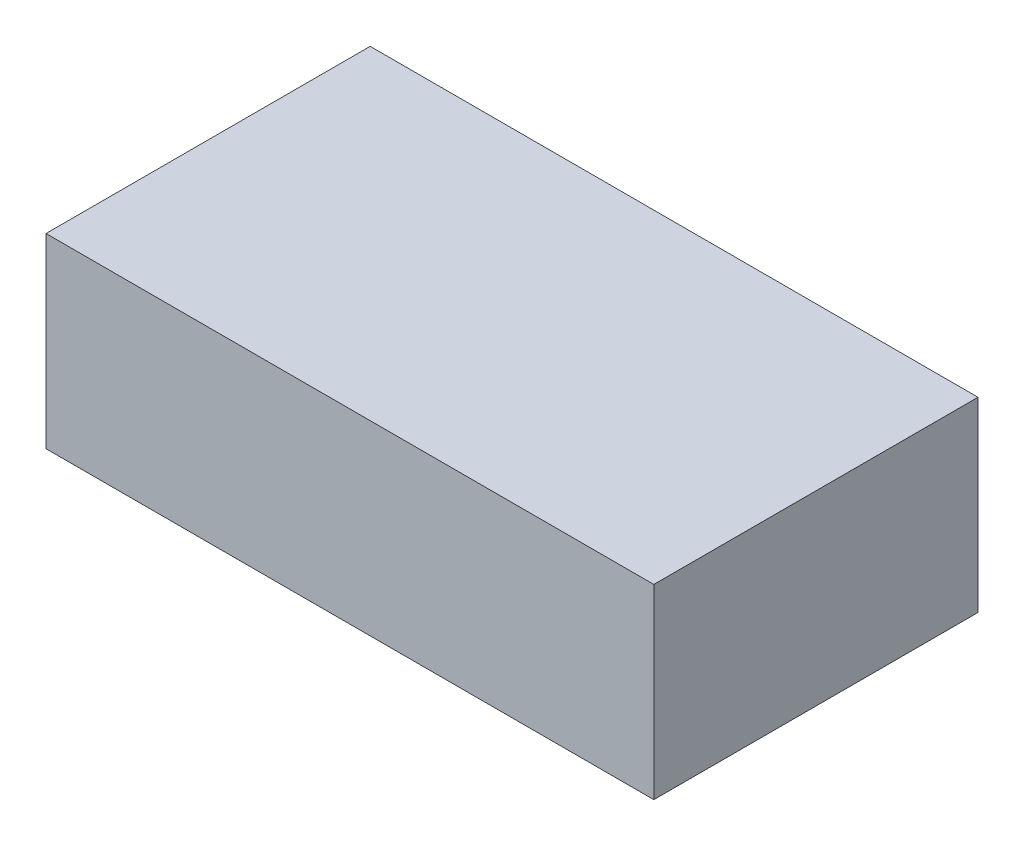
ISO-10303-21;
HEADER;
FILE_DESCRIPTION(('STEP AP214'),'2;1');
FILE_NAME('part.step','',(''),(''),'','','');
FILE_SCHEMA(('AUTOMOTIVE_DESIGN { 1 0 10303 214 1 1 1 1 }'));
ENDSEC;
DATA;
#1=APPLICATION_CONTEXT('core data for automotive mechanical design processes');
#2=APPLICATION_PROTOCOL_DEFINITION('international standard','automotive_design',2000,#1);
#3=PRODUCT_CONTEXT('',#1,'mechanical');
#4=PRODUCT('Part','Part','',(#3));
#5=PRODUCT_RELATED_PRODUCT_CATEGORY('part','',(#4));
#6=PRODUCT_DEFINITION_FORMATION('','',#4);
#7=PRODUCT_DEFINITION_CONTEXT('part definition',#1,'design');
#8=PRODUCT_DEFINITION('design','',#6,#7);
#9=PRODUCT_DEFINITION_SHAPE('','',#8);
#10=(LENGTH_UNIT() NAMED_UNIT(*) SI_UNIT(.MILLI.,.METRE.));
#11=(NAMED_UNIT(*) PLANE_ANGLE_UNIT() SI_UNIT($,.RADIAN.));
#12=(NAMED_UNIT(*) SI_UNIT($,.STERADIAN.) SOLID_ANGLE_UNIT());
#13=UNCERTAINTY_MEASURE_WITH_UNIT(LENGTH_MEASURE(1.E-05),#10,'distance_accuracy_value','');
#14=(GEOMETRIC_REPRESENTATION_CONTEXT(3) GLOBAL_UNCERTAINTY_ASSIGNED_CONTEXT((#13)) GLOBAL_UNIT_ASSIGNED_CONTEXT((#10,
#11,#12)) REPRESENTATION_CONTEXT('',''));
#15=CARTESIAN_POINT('',(0.,0.,0.));
#16=DIRECTION('',(0.,0.,1.));
#17=DIRECTION('',(1.,0.,0.));
#18=AXIS2_PLACEMENT_3D('',#15,#16,#17);
#19=CARTESIAN_POINT('',(0.,0.,0.));
#20=DIRECTION('',(0.,-1.,0.));
#21=DIRECTION('',(0.,0.,-1.));
#22=AXIS2_PLACEMENT_3D('',#19,#20,#21);
#23=PLANE('',#22);
#24=DIRECTION('',(0.,0.,-1.));
#25=VECTOR('',#24,1.);
#26=CARTESIAN_POINT('',(37.5,0.,20.));
#27=LINE('',#26,#25);
#28=CARTESIAN_POINT('',(37.5,0.,20.));
#29=VERTEX_POINT('',#28);
#30=CARTESIAN_POINT('',(37.5,0.,-20.));
#31=VERTEX_POINT('',#30);
#32=EDGE_CURVE('E77',#29,#31,#27,.T.);
#33=ORIENTED_EDGE('',*,*,#32,.F.);
#34=DIRECTION('',(1.,0.,0.));
#35=VECTOR('',#34,1.);
#36=CARTESIAN_POINT('',(-37.5,0.,20.));
#37=LINE('',#36,#35);
#38=CARTESIAN_POINT('',(-37.5,0.,20.));
#39=VERTEX_POINT('',#38);
#40=EDGE_CURVE('E30',#39,#29,#37,.T.);
#41=ORIENTED_EDGE('',*,*,#40,.F.);
#42=DIRECTION('',(0.,0.,1.));
#43=VECTOR('',#42,1.);
#44=CARTESIAN_POINT('',(-37.5,0.,20.));
#45=LINE('',#44,#43);
#46=CARTESIAN_POINT('',(-37.5,0.,-20.));
#47=VERTEX_POINT('',#46);
#48=EDGE_CURVE('E92',#47,#39,#45,.T.);
#49=ORIENTED_EDGE('',*,*,#48,.F.);
#50=DIRECTION('',(-1.,0.,0.));
#51=VECTOR('',#50,1.);
#52=CARTESIAN_POINT('',(-37.5,0.,-20.));
#53=LINE('',#52,#51);
#54=EDGE_CURVE('E85',#31,#47,#53,.T.);
#55=ORIENTED_EDGE('',*,*,#54,.F.);
#56=EDGE_LOOP('',(#33,#41,#49,#55));
#57=FACE_BOUND('',#56,.T.);
#58=ADVANCED_FACE('F17',(#57),#23,.T.);
#59=CARTESIAN_POINT('',(0.,23.,0.));
#60=DIRECTION('',(0.,-1.,0.));
#61=DIRECTION('',(0.,0.,-1.));
#62=AXIS2_PLACEMENT_3D('',#59,#60,#61);
#63=PLANE('',#62);
#64=DIRECTION('',(0.,0.,-1.));
#65=VECTOR('',#64,1.);
#66=CARTESIAN_POINT('',(37.5,23.,20.));
#67=LINE('',#66,#65);
#68=CARTESIAN_POINT('',(37.5,23.,20.));
#69=VERTEX_POINT('',#68);
#70=CARTESIAN_POINT('',(37.5,23.,-20.));
#71=VERTEX_POINT('',#70);
#72=EDGE_CURVE('E79',#69,#71,#67,.T.);
#73=ORIENTED_EDGE('',*,*,#72,.T.);
#74=DIRECTION('',(-1.,0.,0.));
#75=VECTOR('',#74,1.);
#76=CARTESIAN_POINT('',(-37.5,23.,-20.));
#77=LINE('',#76,#75);
#78=CARTESIAN_POINT('',(-37.5,23.,-20.));
#79=VERTEX_POINT('',#78);
#80=EDGE_CURVE('E100',#71,#79,#77,.T.);
#81=ORIENTED_EDGE('',*,*,#80,.T.);
#82=DIRECTION('',(0.,0.,1.));
#83=VECTOR('',#82,1.);
#84=CARTESIAN_POINT('',(-37.5,23.,20.));
#85=LINE('',#84,#83);
#86=CARTESIAN_POINT('',(-37.5,23.,20.));
#87=VERTEX_POINT('',#86);
#88=EDGE_CURVE('E73',#79,#87,#85,.T.);
#89=ORIENTED_EDGE('',*,*,#88,.T.);
#90=DIRECTION('',(1.,0.,0.));
#91=VECTOR('',#90,1.);
#92=CARTESIAN_POINT('',(-37.5,23.,20.));
#93=LINE('',#92,#91);
#94=EDGE_CURVE('E11',#87,#69,#93,.T.);
#95=ORIENTED_EDGE('',*,*,#94,.T.);
#96=EDGE_LOOP('',(#73,#81,#89,#95));
#97=FACE_BOUND('',#96,.T.);
#98=ADVANCED_FACE('F19',(#97),#63,.F.);
#99=CARTESIAN_POINT('',(-37.5,23.,20.));
#100=DIRECTION('',(0.,0.,-1.));
#101=DIRECTION('',(0.,-1.,0.));
#102=AXIS2_PLACEMENT_3D('',#99,#100,#101);
#103=PLANE('',#102);
#104=ORIENTED_EDGE('',*,*,#40,.T.);
#105=DIRECTION('',(0.,-1.,0.));
#106=VECTOR('',#105,1.);
#107=CARTESIAN_POINT('',(37.5,23.,20.));
#108=LINE('',#107,#106);
#109=EDGE_CURVE('E65',#69,#29,#108,.T.);
#110=ORIENTED_EDGE('',*,*,#109,.F.);
#111=ORIENTED_EDGE('',*,*,#94,.F.);
#112=DIRECTION('',(0.,-1.,0.));
#113=VECTOR('',#112,1.);
#114=CARTESIAN_POINT('',(-37.5,23.,20.));
#115=LINE('',#114,#113);
#116=EDGE_CURVE('E68',#87,#39,#115,.T.);
#117=ORIENTED_EDGE('',*,*,#116,.T.);
#118=EDGE_LOOP('',(#104,#110,#111,#117));
#119=FACE_BOUND('',#118,.T.);
#120=ADVANCED_FACE('F63',(#119),#103,.F.);
#121=CARTESIAN_POINT('',(-37.5,23.,20.));
#122=DIRECTION('',(1.,0.,0.));
#123=DIRECTION('',(0.,1.,0.));
#124=AXIS2_PLACEMENT_3D('',#121,#122,#123);
#125=PLANE('',#124);
#126=ORIENTED_EDGE('',*,*,#48,.T.);
#127=ORIENTED_EDGE('',*,*,#116,.F.);
#128=ORIENTED_EDGE('',*,*,#88,.F.);
#129=DIRECTION('',(0.,-1.,0.));
#130=VECTOR('',#129,1.);
#131=CARTESIAN_POINT('',(-37.5,23.,-20.));
#132=LINE('',#131,#130);
#133=EDGE_CURVE('E104',#79,#47,#132,.T.);
#134=ORIENTED_EDGE('',*,*,#133,.T.);
#135=EDGE_LOOP('',(#126,#127,#128,#134));
#136=FACE_BOUND('',#135,.T.);
#137=ADVANCED_FACE('F182',(#136),#125,.F.);
#138=CARTESIAN_POINT('',(-37.5,23.,-20.));
#139=DIRECTION('',(0.,0.,1.));
#140=DIRECTION('',(1.,0.,0.));
#141=AXIS2_PLACEMENT_3D('',#138,#139,#140);
#142=PLANE('',#141);
#143=ORIENTED_EDGE('',*,*,#54,.T.);
#144=ORIENTED_EDGE('',*,*,#133,.F.);
#145=ORIENTED_EDGE('',*,*,#80,.F.);
#146=DIRECTION('',(0.,-1.,0.));
#147=VECTOR('',#146,1.);
#148=CARTESIAN_POINT('',(37.5,23.,-20.));
#149=LINE('',#148,#147);
#150=EDGE_CURVE('E87',#71,#31,#149,.T.);
#151=ORIENTED_EDGE('',*,*,#150,.T.);
#152=EDGE_LOOP('',(#143,#144,#145,#151));
#153=FACE_BOUND('',#152,.T.);
#154=ADVANCED_FACE('F176',(#153),#142,.F.);
#155=CARTESIAN_POINT('',(37.5,23.,20.));
#156=DIRECTION('',(-1.,0.,0.));
#157=DIRECTION('',(0.,0.,1.));
#158=AXIS2_PLACEMENT_3D('',#155,#156,#157);
#159=PLANE('',#158);
#160=ORIENTED_EDGE('',*,*,#32,.T.);
#161=ORIENTED_EDGE('',*,*,#150,.F.);
#162=ORIENTED_EDGE('',*,*,#72,.F.);
#163=ORIENTED_EDGE('',*,*,#109,.T.);
#164=EDGE_LOOP('',(#160,#161,#162,#163));
#165=FACE_BOUND('',#164,.T.);
#166=ADVANCED_FACE('F76',(#165),#159,.F.);
#167=CLOSED_SHELL('',(#58,#98,#120,#137,#154,#166));
#168=MANIFOLD_SOLID_BREP('B1',#167);
#169=ADVANCED_BREP_SHAPE_REPRESENTATION('',(#18,#168),#14);
#170=SHAPE_DEFINITION_REPRESENTATION(#9,#169);
ENDSEC;
END-ISO-10303-21;
